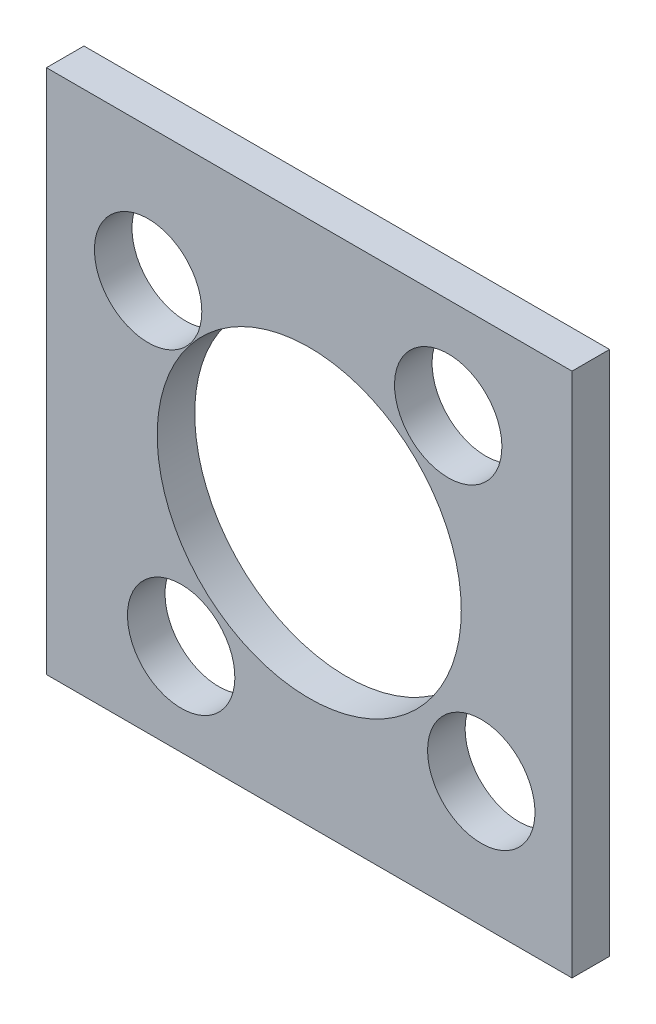
ISO-10303-21;
HEADER;
FILE_DESCRIPTION(('STEP AP214'),'2;1');
FILE_NAME('part.step','',(''),(''),'','','');
FILE_SCHEMA(('AUTOMOTIVE_DESIGN { 1 0 10303 214 1 1 1 1 }'));
ENDSEC;
DATA;
#1=APPLICATION_CONTEXT('core data for automotive mechanical design processes');
#2=APPLICATION_PROTOCOL_DEFINITION('international standard','automotive_design',2000,#1);
#3=PRODUCT_CONTEXT('',#1,'mechanical');
#4=PRODUCT('Part','Part','',(#3));
#5=PRODUCT_RELATED_PRODUCT_CATEGORY('part','',(#4));
#6=PRODUCT_DEFINITION_FORMATION('','',#4);
#7=PRODUCT_DEFINITION_CONTEXT('part definition',#1,'design');
#8=PRODUCT_DEFINITION('design','',#6,#7);
#9=PRODUCT_DEFINITION_SHAPE('','',#8);
#10=(LENGTH_UNIT() NAMED_UNIT(*) SI_UNIT(.MILLI.,.METRE.));
#11=(NAMED_UNIT(*) PLANE_ANGLE_UNIT() SI_UNIT($,.RADIAN.));
#12=(NAMED_UNIT(*) SI_UNIT($,.STERADIAN.) SOLID_ANGLE_UNIT());
#13=UNCERTAINTY_MEASURE_WITH_UNIT(LENGTH_MEASURE(1.E-05),#10,'distance_accuracy_value','');
#14=(GEOMETRIC_REPRESENTATION_CONTEXT(3) GLOBAL_UNCERTAINTY_ASSIGNED_CONTEXT((#13)) GLOBAL_UNIT_ASSIGNED_CONTEXT((#10,
#11,#12)) REPRESENTATION_CONTEXT('',''));
#15=CARTESIAN_POINT('',(0.,0.,0.));
#16=DIRECTION('',(0.,0.,1.));
#17=DIRECTION('',(1.,0.,0.));
#18=AXIS2_PLACEMENT_3D('',#15,#16,#17);
#19=CARTESIAN_POINT('',(70.,70.,10.));
#20=DIRECTION('',(-1.,0.,0.));
#21=DIRECTION('',(0.,-1.,0.));
#22=AXIS2_PLACEMENT_3D('',#19,#20,#21);
#23=PLANE('',#22);
#24=DIRECTION('',(0.,1.,0.));
#25=VECTOR('',#24,1.);
#26=CARTESIAN_POINT('',(70.,70.,0.));
#27=LINE('',#26,#25);
#28=CARTESIAN_POINT('',(70.,-70.,0.));
#29=VERTEX_POINT('',#28);
#30=CARTESIAN_POINT('',(70.,70.,0.));
#31=VERTEX_POINT('',#30);
#32=EDGE_CURVE('E113',#29,#31,#27,.T.);
#33=ORIENTED_EDGE('',*,*,#32,.T.);
#34=DIRECTION('',(0.,0.,-1.));
#35=VECTOR('',#34,1.);
#36=CARTESIAN_POINT('',(70.,70.,10.));
#37=LINE('',#36,#35);
#38=CARTESIAN_POINT('',(70.,70.,10.));
#39=VERTEX_POINT('',#38);
#40=EDGE_CURVE('E11',#39,#31,#37,.T.);
#41=ORIENTED_EDGE('',*,*,#40,.F.);
#42=DIRECTION('',(0.,1.,0.));
#43=VECTOR('',#42,1.);
#44=CARTESIAN_POINT('',(70.,70.,10.));
#45=LINE('',#44,#43);
#46=CARTESIAN_POINT('',(70.,-70.,10.));
#47=VERTEX_POINT('',#46);
#48=EDGE_CURVE('E97',#47,#39,#45,.T.);
#49=ORIENTED_EDGE('',*,*,#48,.F.);
#50=DIRECTION('',(0.,0.,-1.));
#51=VECTOR('',#50,1.);
#52=CARTESIAN_POINT('',(70.,-70.,10.));
#53=LINE('',#52,#51);
#54=EDGE_CURVE('E109',#47,#29,#53,.T.);
#55=ORIENTED_EDGE('',*,*,#54,.T.);
#56=EDGE_LOOP('',(#33,#41,#49,#55));
#57=FACE_BOUND('',#56,.T.);
#58=ADVANCED_FACE('F45',(#57),#23,.F.);
#59=CARTESIAN_POINT('',(-70.,70.,10.));
#60=DIRECTION('',(0.,-1.,0.));
#61=DIRECTION('',(0.,0.,-1.));
#62=AXIS2_PLACEMENT_3D('',#59,#60,#61);
#63=PLANE('',#62);
#64=DIRECTION('',(-1.,0.,0.));
#65=VECTOR('',#64,1.);
#66=CARTESIAN_POINT('',(-70.,70.,0.));
#67=LINE('',#66,#65);
#68=CARTESIAN_POINT('',(-70.,70.,0.));
#69=VERTEX_POINT('',#68);
#70=EDGE_CURVE('E102',#31,#69,#67,.T.);
#71=ORIENTED_EDGE('',*,*,#70,.T.);
#72=DIRECTION('',(0.,0.,-1.));
#73=VECTOR('',#72,1.);
#74=CARTESIAN_POINT('',(-70.,70.,10.));
#75=LINE('',#74,#73);
#76=CARTESIAN_POINT('',(-70.,70.,10.));
#77=VERTEX_POINT('',#76);
#78=EDGE_CURVE('E54',#77,#69,#75,.T.);
#79=ORIENTED_EDGE('',*,*,#78,.F.);
#80=DIRECTION('',(-1.,0.,0.));
#81=VECTOR('',#80,1.);
#82=CARTESIAN_POINT('',(-70.,70.,10.));
#83=LINE('',#82,#81);
#84=EDGE_CURVE('E92',#39,#77,#83,.T.);
#85=ORIENTED_EDGE('',*,*,#84,.F.);
#86=ORIENTED_EDGE('',*,*,#40,.T.);
#87=EDGE_LOOP('',(#71,#79,#85,#86));
#88=FACE_BOUND('',#87,.T.);
#89=ADVANCED_FACE('F101',(#88),#63,.F.);
#90=CARTESIAN_POINT('',(-70.,70.,10.));
#91=DIRECTION('',(1.,0.,0.));
#92=DIRECTION('',(0.,1.,0.));
#93=AXIS2_PLACEMENT_3D('',#90,#91,#92);
#94=PLANE('',#93);
#95=DIRECTION('',(0.,-1.,0.));
#96=VECTOR('',#95,1.);
#97=CARTESIAN_POINT('',(-70.,70.,0.));
#98=LINE('',#97,#96);
#99=CARTESIAN_POINT('',(-70.,-70.,0.));
#100=VERTEX_POINT('',#99);
#101=EDGE_CURVE('E79',#69,#100,#98,.T.);
#102=ORIENTED_EDGE('',*,*,#101,.T.);
#103=DIRECTION('',(0.,0.,-1.));
#104=VECTOR('',#103,1.);
#105=CARTESIAN_POINT('',(-70.,-70.,10.));
#106=LINE('',#105,#104);
#107=CARTESIAN_POINT('',(-70.,-70.,10.));
#108=VERTEX_POINT('',#107);
#109=EDGE_CURVE('E104',#108,#100,#106,.T.);
#110=ORIENTED_EDGE('',*,*,#109,.F.);
#111=DIRECTION('',(0.,-1.,0.));
#112=VECTOR('',#111,1.);
#113=CARTESIAN_POINT('',(-70.,70.,10.));
#114=LINE('',#113,#112);
#115=EDGE_CURVE('E95',#77,#108,#114,.T.);
#116=ORIENTED_EDGE('',*,*,#115,.F.);
#117=ORIENTED_EDGE('',*,*,#78,.T.);
#118=EDGE_LOOP('',(#102,#110,#116,#117));
#119=FACE_BOUND('',#118,.T.);
#120=ADVANCED_FACE('F105',(#119),#94,.F.);
#121=CARTESIAN_POINT('',(-70.,-70.,10.));
#122=DIRECTION('',(0.,1.,0.));
#123=DIRECTION('',(0.,0.,1.));
#124=AXIS2_PLACEMENT_3D('',#121,#122,#123);
#125=PLANE('',#124);
#126=DIRECTION('',(1.,0.,0.));
#127=VECTOR('',#126,1.);
#128=CARTESIAN_POINT('',(-70.,-70.,0.));
#129=LINE('',#128,#127);
#130=EDGE_CURVE('E85',#100,#29,#129,.T.);
#131=ORIENTED_EDGE('',*,*,#130,.T.);
#132=ORIENTED_EDGE('',*,*,#54,.F.);
#133=DIRECTION('',(1.,0.,0.));
#134=VECTOR('',#133,1.);
#135=CARTESIAN_POINT('',(-70.,-70.,10.));
#136=LINE('',#135,#134);
#137=EDGE_CURVE('E62',#108,#47,#136,.T.);
#138=ORIENTED_EDGE('',*,*,#137,.F.);
#139=ORIENTED_EDGE('',*,*,#109,.T.);
#140=EDGE_LOOP('',(#131,#132,#138,#139));
#141=FACE_BOUND('',#140,.T.);
#142=ADVANCED_FACE('F127',(#141),#125,.F.);
#143=CARTESIAN_POINT('',(0.,0.,10.));
#144=DIRECTION('',(0.,0.,1.));
#145=DIRECTION('',(1.,0.,0.));
#146=AXIS2_PLACEMENT_3D('',#143,#144,#145);
#147=PLANE('',#146);
#148=CARTESIAN_POINT('',(0.,0.,10.));
#149=DIRECTION('',(0.,0.,1.));
#150=DIRECTION('',(1.,0.,0.));
#151=AXIS2_PLACEMENT_3D('',#148,#149,#150);
#152=CIRCLE('',#151,40.5);
#153=CARTESIAN_POINT('',(40.5,0.,10.));
#154=VERTEX_POINT('',#153);
#155=EDGE_CURVE('E166',#154,#154,#152,.T.);
#156=ORIENTED_EDGE('',*,*,#155,.F.);
#157=EDGE_LOOP('',(#156));
#158=FACE_BOUND('',#157,.T.);
#159=CARTESIAN_POINT('',(-34.1100683138557,-45.5353710429615,10.));
#160=DIRECTION('',(0.,0.,1.));
#161=DIRECTION('',(0.,1.,0.));
#162=AXIS2_PLACEMENT_3D('',#159,#160,#161);
#163=CIRCLE('',#162,14.3);
#164=CARTESIAN_POINT('',(-34.1100683138557,-31.2353710429616,10.));
#165=VERTEX_POINT('',#164);
#166=EDGE_CURVE('E159',#165,#165,#163,.T.);
#167=ORIENTED_EDGE('',*,*,#166,.F.);
#168=EDGE_LOOP('',(#167));
#169=FACE_BOUND('',#168,.T.);
#170=CARTESIAN_POINT('',(45.8239809530621,-36.7300465886658,10.));
#171=DIRECTION('',(0.,0.,1.));
#172=DIRECTION('',(-1.,0.,0.));
#173=AXIS2_PLACEMENT_3D('',#170,#171,#172);
#174=CIRCLE('',#173,14.3);
#175=CARTESIAN_POINT('',(31.5239809530621,-36.7300465886658,10.));
#176=VERTEX_POINT('',#175);
#177=EDGE_CURVE('E151',#176,#176,#174,.T.);
#178=ORIENTED_EDGE('',*,*,#177,.F.);
#179=EDGE_LOOP('',(#178));
#180=FACE_BOUND('',#179,.T.);
#181=CARTESIAN_POINT('',(37.018656498766,43.2040026782525,10.));
#182=DIRECTION('',(0.,0.,1.));
#183=DIRECTION('',(0.,-1.,0.));
#184=AXIS2_PLACEMENT_3D('',#181,#182,#183);
#185=CIRCLE('',#184,14.3);
#186=CARTESIAN_POINT('',(37.0186564987662,28.9040026782525,10.));
#187=VERTEX_POINT('',#186);
#188=EDGE_CURVE('E142',#187,#187,#185,.T.);
#189=ORIENTED_EDGE('',*,*,#188,.F.);
#190=EDGE_LOOP('',(#189));
#191=FACE_BOUND('',#190,.T.);
#192=CARTESIAN_POINT('',(-42.9153927681514,34.3986782239565,10.));
#193=DIRECTION('',(0.,0.,1.));
#194=DIRECTION('',(1.,0.,0.));
#195=AXIS2_PLACEMENT_3D('',#192,#193,#194);
#196=CIRCLE('',#195,14.3);
#197=CARTESIAN_POINT('',(-28.6153927681514,34.3986782239565,10.));
#198=VERTEX_POINT('',#197);
#199=EDGE_CURVE('E134',#198,#198,#196,.T.);
#200=ORIENTED_EDGE('',*,*,#199,.F.);
#201=EDGE_LOOP('',(#200));
#202=FACE_BOUND('',#201,.T.);
#203=ORIENTED_EDGE('',*,*,#48,.T.);
#204=ORIENTED_EDGE('',*,*,#84,.T.);
#205=ORIENTED_EDGE('',*,*,#115,.T.);
#206=ORIENTED_EDGE('',*,*,#137,.T.);
#207=EDGE_LOOP('',(#203,#204,#205,#206));
#208=FACE_BOUND('',#207,.T.);
#209=ADVANCED_FACE('F93',(#158,#169,#180,#191,#202,#208),#147,.T.);
#210=CARTESIAN_POINT('',(0.,0.,0.));
#211=DIRECTION('',(0.,0.,1.));
#212=DIRECTION('',(1.,0.,0.));
#213=AXIS2_PLACEMENT_3D('',#210,#211,#212);
#214=PLANE('',#213);
#215=CARTESIAN_POINT('',(0.,0.,0.));
#216=DIRECTION('',(0.,0.,1.));
#217=DIRECTION('',(1.,0.,0.));
#218=AXIS2_PLACEMENT_3D('',#215,#216,#217);
#219=CIRCLE('',#218,40.5);
#220=CARTESIAN_POINT('',(40.5,0.,0.));
#221=VERTEX_POINT('',#220);
#222=EDGE_CURVE('E147',#221,#221,#219,.T.);
#223=ORIENTED_EDGE('',*,*,#222,.T.);
#224=EDGE_LOOP('',(#223));
#225=FACE_BOUND('',#224,.T.);
#226=CARTESIAN_POINT('',(-34.1100683138557,-45.5353710429615,0.));
#227=DIRECTION('',(0.,0.,1.));
#228=DIRECTION('',(0.,1.,0.));
#229=AXIS2_PLACEMENT_3D('',#226,#227,#228);
#230=CIRCLE('',#229,14.3);
#231=CARTESIAN_POINT('',(-34.1100683138557,-31.2353710429616,0.));
#232=VERTEX_POINT('',#231);
#233=EDGE_CURVE('E138',#232,#232,#230,.T.);
#234=ORIENTED_EDGE('',*,*,#233,.T.);
#235=EDGE_LOOP('',(#234));
#236=FACE_BOUND('',#235,.T.);
#237=CARTESIAN_POINT('',(45.8239809530621,-36.7300465886658,0.));
#238=DIRECTION('',(0.,0.,1.));
#239=DIRECTION('',(-1.,0.,0.));
#240=AXIS2_PLACEMENT_3D('',#237,#238,#239);
#241=CIRCLE('',#240,14.3);
#242=CARTESIAN_POINT('',(31.5239809530621,-36.7300465886658,0.));
#243=VERTEX_POINT('',#242);
#244=EDGE_CURVE('E155',#243,#243,#241,.T.);
#245=ORIENTED_EDGE('',*,*,#244,.T.);
#246=EDGE_LOOP('',(#245));
#247=FACE_BOUND('',#246,.T.);
#248=CARTESIAN_POINT('',(37.018656498766,43.2040026782525,0.));
#249=DIRECTION('',(0.,0.,1.));
#250=DIRECTION('',(0.,-1.,0.));
#251=AXIS2_PLACEMENT_3D('',#248,#249,#250);
#252=CIRCLE('',#251,14.3);
#253=CARTESIAN_POINT('',(37.0186564987662,28.9040026782525,0.));
#254=VERTEX_POINT('',#253);
#255=EDGE_CURVE('E146',#254,#254,#252,.T.);
#256=ORIENTED_EDGE('',*,*,#255,.T.);
#257=EDGE_LOOP('',(#256));
#258=FACE_BOUND('',#257,.T.);
#259=CARTESIAN_POINT('',(-42.9153927681514,34.3986782239565,0.));
#260=DIRECTION('',(0.,0.,1.));
#261=DIRECTION('',(1.,0.,0.));
#262=AXIS2_PLACEMENT_3D('',#259,#260,#261);
#263=CIRCLE('',#262,14.3);
#264=CARTESIAN_POINT('',(-28.6153927681514,34.3986782239565,0.));
#265=VERTEX_POINT('',#264);
#266=EDGE_CURVE('E117',#265,#265,#263,.T.);
#267=ORIENTED_EDGE('',*,*,#266,.T.);
#268=EDGE_LOOP('',(#267));
#269=FACE_BOUND('',#268,.T.);
#270=ORIENTED_EDGE('',*,*,#32,.F.);
#271=ORIENTED_EDGE('',*,*,#130,.F.);
#272=ORIENTED_EDGE('',*,*,#101,.F.);
#273=ORIENTED_EDGE('',*,*,#70,.F.);
#274=EDGE_LOOP('',(#270,#271,#272,#273));
#275=FACE_BOUND('',#274,.T.);
#276=ADVANCED_FACE('F130',(#225,#236,#247,#258,#269,#275),#214,.F.);
#277=CARTESIAN_POINT('',(-42.9153927681514,34.3986782239565,0.));
#278=DIRECTION('',(0.,0.,1.));
#279=DIRECTION('',(1.,0.,0.));
#280=AXIS2_PLACEMENT_3D('',#277,#278,#279);
#281=CYLINDRICAL_SURFACE('',#280,14.3);
#282=ORIENTED_EDGE('',*,*,#266,.F.);
#283=EDGE_LOOP('',(#282));
#284=FACE_BOUND('',#283,.T.);
#285=ORIENTED_EDGE('',*,*,#199,.T.);
#286=EDGE_LOOP('',(#285));
#287=FACE_BOUND('',#286,.T.);
#288=ADVANCED_FACE('F194',(#284,#287),#281,.F.);
#289=CARTESIAN_POINT('',(37.018656498766,43.2040026782525,0.));
#290=DIRECTION('',(0.,0.,1.));
#291=DIRECTION('',(1.,0.,0.));
#292=AXIS2_PLACEMENT_3D('',#289,#290,#291);
#293=CYLINDRICAL_SURFACE('',#292,14.3);
#294=ORIENTED_EDGE('',*,*,#255,.F.);
#295=EDGE_LOOP('',(#294));
#296=FACE_BOUND('',#295,.T.);
#297=ORIENTED_EDGE('',*,*,#188,.T.);
#298=EDGE_LOOP('',(#297));
#299=FACE_BOUND('',#298,.T.);
#300=ADVANCED_FACE('F196',(#296,#299),#293,.F.);
#301=CARTESIAN_POINT('',(45.8239809530621,-36.7300465886658,0.));
#302=DIRECTION('',(0.,0.,1.));
#303=DIRECTION('',(1.,0.,0.));
#304=AXIS2_PLACEMENT_3D('',#301,#302,#303);
#305=CYLINDRICAL_SURFACE('',#304,14.3);
#306=ORIENTED_EDGE('',*,*,#244,.F.);
#307=EDGE_LOOP('',(#306));
#308=FACE_BOUND('',#307,.T.);
#309=ORIENTED_EDGE('',*,*,#177,.T.);
#310=EDGE_LOOP('',(#309));
#311=FACE_BOUND('',#310,.T.);
#312=ADVANCED_FACE('F203',(#308,#311),#305,.F.);
#313=CARTESIAN_POINT('',(-34.1100683138557,-45.5353710429615,0.));
#314=DIRECTION('',(0.,0.,1.));
#315=DIRECTION('',(1.,0.,0.));
#316=AXIS2_PLACEMENT_3D('',#313,#314,#315);
#317=CYLINDRICAL_SURFACE('',#316,14.3);
#318=ORIENTED_EDGE('',*,*,#233,.F.);
#319=EDGE_LOOP('',(#318));
#320=FACE_BOUND('',#319,.T.);
#321=ORIENTED_EDGE('',*,*,#166,.T.);
#322=EDGE_LOOP('',(#321));
#323=FACE_BOUND('',#322,.T.);
#324=ADVANCED_FACE('F179',(#320,#323),#317,.F.);
#325=CARTESIAN_POINT('',(0.,0.,0.));
#326=DIRECTION('',(0.,0.,1.));
#327=DIRECTION('',(1.,0.,0.));
#328=AXIS2_PLACEMENT_3D('',#325,#326,#327);
#329=CYLINDRICAL_SURFACE('',#328,40.5);
#330=ORIENTED_EDGE('',*,*,#222,.F.);
#331=EDGE_LOOP('',(#330));
#332=FACE_BOUND('',#331,.T.);
#333=ORIENTED_EDGE('',*,*,#155,.T.);
#334=EDGE_LOOP('',(#333));
#335=FACE_BOUND('',#334,.T.);
#336=ADVANCED_FACE('F176',(#332,#335),#329,.F.);
#337=CLOSED_SHELL('',(#58,#89,#120,#142,#209,#276,#288,#300,#312,#324,#336));
#338=MANIFOLD_SOLID_BREP('B2',#337);
#339=ADVANCED_BREP_SHAPE_REPRESENTATION('',(#18,#338),#14);
#340=SHAPE_DEFINITION_REPRESENTATION(#9,#339);
ENDSEC;
END-ISO-10303-21;
